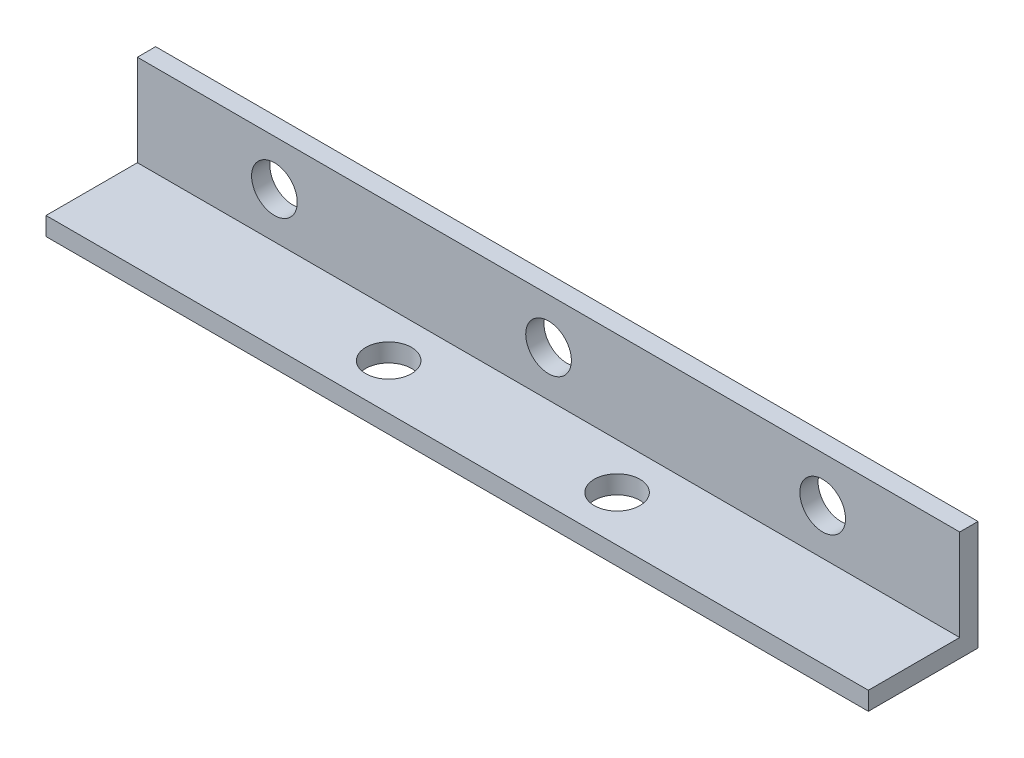
ISO-10303-21;
HEADER;
FILE_DESCRIPTION(('STEP AP214'),'2;1');
FILE_NAME('part.step','',(''),(''),'','','');
FILE_SCHEMA(('AUTOMOTIVE_DESIGN { 1 0 10303 214 1 1 1 1 }'));
ENDSEC;
DATA;
#1=APPLICATION_CONTEXT('core data for automotive mechanical design processes');
#2=APPLICATION_PROTOCOL_DEFINITION('international standard','automotive_design',2000,#1);
#3=PRODUCT_CONTEXT('',#1,'mechanical');
#4=PRODUCT('Part','Part','',(#3));
#5=PRODUCT_RELATED_PRODUCT_CATEGORY('part','',(#4));
#6=PRODUCT_DEFINITION_FORMATION('','',#4);
#7=PRODUCT_DEFINITION_CONTEXT('part definition',#1,'design');
#8=PRODUCT_DEFINITION('design','',#6,#7);
#9=PRODUCT_DEFINITION_SHAPE('','',#8);
#10=(LENGTH_UNIT() NAMED_UNIT(*) SI_UNIT(.MILLI.,.METRE.));
#11=(NAMED_UNIT(*) PLANE_ANGLE_UNIT() SI_UNIT($,.RADIAN.));
#12=(NAMED_UNIT(*) SI_UNIT($,.STERADIAN.) SOLID_ANGLE_UNIT());
#13=UNCERTAINTY_MEASURE_WITH_UNIT(LENGTH_MEASURE(1.E-05),#10,'distance_accuracy_value','');
#14=(GEOMETRIC_REPRESENTATION_CONTEXT(3) GLOBAL_UNCERTAINTY_ASSIGNED_CONTEXT((#13)) GLOBAL_UNIT_ASSIGNED_CONTEXT((#10,
#11,#12)) REPRESENTATION_CONTEXT('',''));
#15=CARTESIAN_POINT('',(0.,0.,0.));
#16=DIRECTION('',(0.,0.,1.));
#17=DIRECTION('',(1.,0.,0.));
#18=AXIS2_PLACEMENT_3D('',#15,#16,#17);
#19=CARTESIAN_POINT('',(0.,2.,0.));
#20=DIRECTION('',(0.,-1.,0.));
#21=DIRECTION('',(0.,0.,-1.));
#22=AXIS2_PLACEMENT_3D('',#19,#20,#21);
#23=PLANE('',#22);
#24=CARTESIAN_POINT('',(-28.6666666666666,2.,-0.416666666666659));
#25=DIRECTION('',(0.,-1.,0.));
#26=DIRECTION('',(0.,0.,-1.));
#27=AXIS2_PLACEMENT_3D('',#24,#25,#26);
#28=CIRCLE('',#27,2.5);
#29=CARTESIAN_POINT('',(-28.6666666666666,2.,-2.91666666666666));
#30=VERTEX_POINT('',#29);
#31=EDGE_CURVE('E139',#30,#30,#28,.T.);
#32=ORIENTED_EDGE('',*,*,#31,.T.);
#33=EDGE_LOOP('',(#32));
#34=FACE_BOUND('',#33,.T.);
#35=CARTESIAN_POINT('',(-3.66666666666664,2.,-0.416666666666659));
#36=DIRECTION('',(0.,-1.,0.));
#37=DIRECTION('',(0.,0.,-1.));
#38=AXIS2_PLACEMENT_3D('',#35,#36,#37);
#39=CIRCLE('',#38,2.5);
#40=CARTESIAN_POINT('',(-3.66666666666664,2.,-2.91666666666666));
#41=VERTEX_POINT('',#40);
#42=EDGE_CURVE('E134',#41,#41,#39,.T.);
#43=ORIENTED_EDGE('',*,*,#42,.T.);
#44=EDGE_LOOP('',(#43));
#45=FACE_BOUND('',#44,.T.);
#46=DIRECTION('',(1.,0.,0.));
#47=VECTOR('',#46,1.);
#48=CARTESIAN_POINT('',(-61.1666666666666,2.,-5.41666666666666));
#49=LINE('',#48,#47);
#50=CARTESIAN_POINT('',(-61.1666666666666,2.,-5.41666666666666));
#51=VERTEX_POINT('',#50);
#52=CARTESIAN_POINT('',(28.8333333333334,2.,-5.41666666666666));
#53=VERTEX_POINT('',#52);
#54=EDGE_CURVE('E53',#51,#53,#49,.T.);
#55=ORIENTED_EDGE('',*,*,#54,.F.);
#56=DIRECTION('',(0.,0.,1.));
#57=VECTOR('',#56,1.);
#58=CARTESIAN_POINT('',(-61.1666666666666,2.,4.58333333333334));
#59=LINE('',#58,#57);
#60=CARTESIAN_POINT('',(-61.1666666666666,2.,4.58333333333334));
#61=VERTEX_POINT('',#60);
#62=EDGE_CURVE('E156',#51,#61,#59,.T.);
#63=ORIENTED_EDGE('',*,*,#62,.T.);
#64=DIRECTION('',(1.,0.,0.));
#65=VECTOR('',#64,1.);
#66=CARTESIAN_POINT('',(-61.1666666666666,2.,4.58333333333334));
#67=LINE('',#66,#65);
#68=CARTESIAN_POINT('',(28.8333333333334,2.,4.58333333333334));
#69=VERTEX_POINT('',#68);
#70=EDGE_CURVE('E59',#61,#69,#67,.T.);
#71=ORIENTED_EDGE('',*,*,#70,.T.);
#72=DIRECTION('',(0.,0.,-1.));
#73=VECTOR('',#72,1.);
#74=CARTESIAN_POINT('',(28.8333333333334,2.,4.58333333333334));
#75=LINE('',#74,#73);
#76=EDGE_CURVE('E88',#69,#53,#75,.T.);
#77=ORIENTED_EDGE('',*,*,#76,.T.);
#78=EDGE_LOOP('',(#55,#63,#71,#77));
#79=FACE_BOUND('',#78,.T.);
#80=ADVANCED_FACE('F36',(#34,#45,#79),#23,.F.);
#81=CARTESIAN_POINT('',(28.8333333333334,2.,4.58333333333334));
#82=DIRECTION('',(-1.,0.,0.));
#83=DIRECTION('',(0.,0.,1.));
#84=AXIS2_PLACEMENT_3D('',#81,#82,#83);
#85=PLANE('',#84);
#86=DIRECTION('',(0.,0.,-1.));
#87=VECTOR('',#86,1.);
#88=CARTESIAN_POINT('',(28.8333333333334,0.,4.58333333333334));
#89=LINE('',#88,#87);
#90=CARTESIAN_POINT('',(28.8333333333334,0.,4.58333333333334));
#91=VERTEX_POINT('',#90);
#92=CARTESIAN_POINT('',(28.8333333333334,0.,-7.41666666666666));
#93=VERTEX_POINT('',#92);
#94=EDGE_CURVE('E94',#91,#93,#89,.T.);
#95=ORIENTED_EDGE('',*,*,#94,.T.);
#96=DIRECTION('',(0.,-1.,0.));
#97=VECTOR('',#96,1.);
#98=CARTESIAN_POINT('',(28.8333333333334,2.,-7.41666666666666));
#99=LINE('',#98,#97);
#100=CARTESIAN_POINT('',(28.8333333333334,12.,-7.41666666666666));
#101=VERTEX_POINT('',#100);
#102=EDGE_CURVE('E11',#101,#93,#99,.T.);
#103=ORIENTED_EDGE('',*,*,#102,.F.);
#104=DIRECTION('',(0.,0.,-1.));
#105=VECTOR('',#104,1.);
#106=CARTESIAN_POINT('',(28.8333333333334,12.,-7.41666666666666));
#107=LINE('',#106,#105);
#108=CARTESIAN_POINT('',(28.8333333333334,12.,-5.41666666666666));
#109=VERTEX_POINT('',#108);
#110=EDGE_CURVE('E148',#109,#101,#107,.T.);
#111=ORIENTED_EDGE('',*,*,#110,.F.);
#112=DIRECTION('',(0.,-1.,0.));
#113=VECTOR('',#112,1.);
#114=CARTESIAN_POINT('',(28.8333333333334,12.,-5.41666666666666));
#115=LINE('',#114,#113);
#116=EDGE_CURVE('E103',#109,#53,#115,.T.);
#117=ORIENTED_EDGE('',*,*,#116,.T.);
#118=ORIENTED_EDGE('',*,*,#76,.F.);
#119=DIRECTION('',(0.,-1.,0.));
#120=VECTOR('',#119,1.);
#121=CARTESIAN_POINT('',(28.8333333333334,2.,4.58333333333334));
#122=LINE('',#121,#120);
#123=EDGE_CURVE('E81',#69,#91,#122,.T.);
#124=ORIENTED_EDGE('',*,*,#123,.T.);
#125=EDGE_LOOP('',(#95,#103,#111,#117,#118,#124));
#126=FACE_BOUND('',#125,.T.);
#127=ADVANCED_FACE('F38',(#126),#85,.F.);
#128=CARTESIAN_POINT('',(-61.1666666666666,2.,-7.41666666666666));
#129=DIRECTION('',(0.,0.,1.));
#130=DIRECTION('',(1.,0.,0.));
#131=AXIS2_PLACEMENT_3D('',#128,#129,#130);
#132=PLANE('',#131);
#133=CARTESIAN_POINT('',(13.8333333333334,7.,-7.41666666666666));
#134=DIRECTION('',(0.,0.,1.));
#135=DIRECTION('',(1.,0.,0.));
#136=AXIS2_PLACEMENT_3D('',#133,#134,#135);
#137=CIRCLE('',#136,2.5);
#138=CARTESIAN_POINT('',(11.3333333333334,7.,-7.41666666666666));
#139=VERTEX_POINT('',#138);
#140=EDGE_CURVE('E127',#139,#139,#137,.T.);
#141=ORIENTED_EDGE('',*,*,#140,.T.);
#142=EDGE_LOOP('',(#141));
#143=FACE_BOUND('',#142,.T.);
#144=CARTESIAN_POINT('',(-16.1666666666666,7.,-7.41666666666666));
#145=DIRECTION('',(0.,0.,1.));
#146=DIRECTION('',(1.,0.,0.));
#147=AXIS2_PLACEMENT_3D('',#144,#145,#146);
#148=CIRCLE('',#147,2.5);
#149=CARTESIAN_POINT('',(-18.6666666666666,7.,-7.41666666666666));
#150=VERTEX_POINT('',#149);
#151=EDGE_CURVE('E117',#150,#150,#148,.T.);
#152=ORIENTED_EDGE('',*,*,#151,.T.);
#153=EDGE_LOOP('',(#152));
#154=FACE_BOUND('',#153,.T.);
#155=CARTESIAN_POINT('',(-46.1666666666666,7.,-7.41666666666666));
#156=DIRECTION('',(0.,0.,1.));
#157=DIRECTION('',(1.,0.,0.));
#158=AXIS2_PLACEMENT_3D('',#155,#156,#157);
#159=CIRCLE('',#158,2.5);
#160=CARTESIAN_POINT('',(-48.6666666666666,7.,-7.41666666666666));
#161=VERTEX_POINT('',#160);
#162=EDGE_CURVE('E114',#161,#161,#159,.T.);
#163=ORIENTED_EDGE('',*,*,#162,.T.);
#164=EDGE_LOOP('',(#163));
#165=FACE_BOUND('',#164,.T.);
#166=DIRECTION('',(-1.,0.,0.));
#167=VECTOR('',#166,1.);
#168=CARTESIAN_POINT('',(-61.1666666666666,0.,-7.41666666666666));
#169=LINE('',#168,#167);
#170=CARTESIAN_POINT('',(-61.1666666666666,0.,-7.41666666666666));
#171=VERTEX_POINT('',#170);
#172=EDGE_CURVE('E98',#93,#171,#169,.T.);
#173=ORIENTED_EDGE('',*,*,#172,.T.);
#174=DIRECTION('',(0.,-1.,0.));
#175=VECTOR('',#174,1.);
#176=CARTESIAN_POINT('',(-61.1666666666666,2.,-7.41666666666666));
#177=LINE('',#176,#175);
#178=CARTESIAN_POINT('',(-61.1666666666666,12.,-7.41666666666666));
#179=VERTEX_POINT('',#178);
#180=EDGE_CURVE('E45',#179,#171,#177,.T.);
#181=ORIENTED_EDGE('',*,*,#180,.F.);
#182=DIRECTION('',(-1.,0.,0.));
#183=VECTOR('',#182,1.);
#184=CARTESIAN_POINT('',(-61.1666666666666,12.,-7.41666666666666));
#185=LINE('',#184,#183);
#186=EDGE_CURVE('E151',#101,#179,#185,.T.);
#187=ORIENTED_EDGE('',*,*,#186,.F.);
#188=ORIENTED_EDGE('',*,*,#102,.T.);
#189=EDGE_LOOP('',(#173,#181,#187,#188));
#190=FACE_BOUND('',#189,.T.);
#191=ADVANCED_FACE('F164',(#143,#154,#165,#190),#132,.F.);
#192=CARTESIAN_POINT('',(-61.1666666666666,2.,4.58333333333334));
#193=DIRECTION('',(1.,0.,0.));
#194=DIRECTION('',(0.,0.,-1.));
#195=AXIS2_PLACEMENT_3D('',#192,#193,#194);
#196=PLANE('',#195);
#197=DIRECTION('',(0.,0.,1.));
#198=VECTOR('',#197,1.);
#199=CARTESIAN_POINT('',(-61.1666666666666,0.,4.58333333333334));
#200=LINE('',#199,#198);
#201=CARTESIAN_POINT('',(-61.1666666666666,0.,4.58333333333334));
#202=VERTEX_POINT('',#201);
#203=EDGE_CURVE('E89',#171,#202,#200,.T.);
#204=ORIENTED_EDGE('',*,*,#203,.T.);
#205=DIRECTION('',(0.,-1.,0.));
#206=VECTOR('',#205,1.);
#207=CARTESIAN_POINT('',(-61.1666666666666,2.,4.58333333333334));
#208=LINE('',#207,#206);
#209=EDGE_CURVE('E84',#61,#202,#208,.T.);
#210=ORIENTED_EDGE('',*,*,#209,.F.);
#211=ORIENTED_EDGE('',*,*,#62,.F.);
#212=DIRECTION('',(0.,-1.,0.));
#213=VECTOR('',#212,1.);
#214=CARTESIAN_POINT('',(-61.1666666666666,12.,-5.41666666666666));
#215=LINE('',#214,#213);
#216=CARTESIAN_POINT('',(-61.1666666666666,12.,-5.41666666666666));
#217=VERTEX_POINT('',#216);
#218=EDGE_CURVE('E99',#217,#51,#215,.T.);
#219=ORIENTED_EDGE('',*,*,#218,.F.);
#220=DIRECTION('',(0.,0.,1.));
#221=VECTOR('',#220,1.);
#222=CARTESIAN_POINT('',(-61.1666666666666,12.,-7.41666666666666));
#223=LINE('',#222,#221);
#224=EDGE_CURVE('E142',#179,#217,#223,.T.);
#225=ORIENTED_EDGE('',*,*,#224,.F.);
#226=ORIENTED_EDGE('',*,*,#180,.T.);
#227=EDGE_LOOP('',(#204,#210,#211,#219,#225,#226));
#228=FACE_BOUND('',#227,.T.);
#229=ADVANCED_FACE('F159',(#228),#196,.F.);
#230=CARTESIAN_POINT('',(-61.1666666666666,2.,4.58333333333334));
#231=DIRECTION('',(0.,0.,-1.));
#232=DIRECTION('',(-1.,0.,0.));
#233=AXIS2_PLACEMENT_3D('',#230,#231,#232);
#234=PLANE('',#233);
#235=DIRECTION('',(1.,0.,0.));
#236=VECTOR('',#235,1.);
#237=CARTESIAN_POINT('',(-61.1666666666666,0.,4.58333333333334));
#238=LINE('',#237,#236);
#239=EDGE_CURVE('E78',#202,#91,#238,.T.);
#240=ORIENTED_EDGE('',*,*,#239,.T.);
#241=ORIENTED_EDGE('',*,*,#123,.F.);
#242=ORIENTED_EDGE('',*,*,#70,.F.);
#243=ORIENTED_EDGE('',*,*,#209,.T.);
#244=EDGE_LOOP('',(#240,#241,#242,#243));
#245=FACE_BOUND('',#244,.T.);
#246=ADVANCED_FACE('F80',(#245),#234,.F.);
#247=CARTESIAN_POINT('',(0.,0.,0.));
#248=DIRECTION('',(0.,-1.,0.));
#249=DIRECTION('',(0.,0.,-1.));
#250=AXIS2_PLACEMENT_3D('',#247,#248,#249);
#251=PLANE('',#250);
#252=CARTESIAN_POINT('',(-28.6666666666666,0.,-0.416666666666659));
#253=DIRECTION('',(0.,1.,0.));
#254=DIRECTION('',(0.,0.,1.));
#255=AXIS2_PLACEMENT_3D('',#252,#253,#254);
#256=CIRCLE('',#255,2.5);
#257=CARTESIAN_POINT('',(-28.6666666666666,0.,2.08333333333334));
#258=VERTEX_POINT('',#257);
#259=EDGE_CURVE('E131',#258,#258,#256,.T.);
#260=ORIENTED_EDGE('',*,*,#259,.T.);
#261=EDGE_LOOP('',(#260));
#262=FACE_BOUND('',#261,.T.);
#263=CARTESIAN_POINT('',(-3.66666666666664,0.,-0.416666666666659));
#264=DIRECTION('',(0.,1.,0.));
#265=DIRECTION('',(0.,0.,1.));
#266=AXIS2_PLACEMENT_3D('',#263,#264,#265);
#267=CIRCLE('',#266,2.5);
#268=CARTESIAN_POINT('',(-3.66666666666664,0.,2.08333333333334));
#269=VERTEX_POINT('',#268);
#270=EDGE_CURVE('E130',#269,#269,#267,.T.);
#271=ORIENTED_EDGE('',*,*,#270,.T.);
#272=EDGE_LOOP('',(#271));
#273=FACE_BOUND('',#272,.T.);
#274=ORIENTED_EDGE('',*,*,#94,.F.);
#275=ORIENTED_EDGE('',*,*,#239,.F.);
#276=ORIENTED_EDGE('',*,*,#203,.F.);
#277=ORIENTED_EDGE('',*,*,#172,.F.);
#278=EDGE_LOOP('',(#274,#275,#276,#277));
#279=FACE_BOUND('',#278,.T.);
#280=ADVANCED_FACE('F97',(#262,#273,#279),#251,.T.);
#281=CARTESIAN_POINT('',(-61.1666666666666,12.,-5.41666666666666));
#282=DIRECTION('',(0.,0.,-1.));
#283=DIRECTION('',(-1.,0.,0.));
#284=AXIS2_PLACEMENT_3D('',#281,#282,#283);
#285=PLANE('',#284);
#286=CARTESIAN_POINT('',(13.8333333333334,7.,-5.41666666666666));
#287=DIRECTION('',(0.,0.,-1.));
#288=DIRECTION('',(-1.,0.,0.));
#289=AXIS2_PLACEMENT_3D('',#286,#287,#288);
#290=CIRCLE('',#289,2.5);
#291=CARTESIAN_POINT('',(11.3333333333334,7.,-5.41666666666666));
#292=VERTEX_POINT('',#291);
#293=EDGE_CURVE('E40',#292,#292,#290,.T.);
#294=ORIENTED_EDGE('',*,*,#293,.T.);
#295=EDGE_LOOP('',(#294));
#296=FACE_BOUND('',#295,.T.);
#297=CARTESIAN_POINT('',(-16.1666666666666,7.,-5.41666666666666));
#298=DIRECTION('',(0.,0.,-1.));
#299=DIRECTION('',(-1.,0.,0.));
#300=AXIS2_PLACEMENT_3D('',#297,#298,#299);
#301=CIRCLE('',#300,2.5);
#302=CARTESIAN_POINT('',(-18.6666666666666,7.,-5.41666666666666));
#303=VERTEX_POINT('',#302);
#304=EDGE_CURVE('E115',#303,#303,#301,.T.);
#305=ORIENTED_EDGE('',*,*,#304,.T.);
#306=EDGE_LOOP('',(#305));
#307=FACE_BOUND('',#306,.T.);
#308=CARTESIAN_POINT('',(-46.1666666666666,7.,-5.41666666666666));
#309=DIRECTION('',(0.,0.,-1.));
#310=DIRECTION('',(-1.,0.,0.));
#311=AXIS2_PLACEMENT_3D('',#308,#309,#310);
#312=CIRCLE('',#311,2.5);
#313=CARTESIAN_POINT('',(-48.6666666666666,7.,-5.41666666666666));
#314=VERTEX_POINT('',#313);
#315=EDGE_CURVE('E112',#314,#314,#312,.T.);
#316=ORIENTED_EDGE('',*,*,#315,.T.);
#317=EDGE_LOOP('',(#316));
#318=FACE_BOUND('',#317,.T.);
#319=ORIENTED_EDGE('',*,*,#54,.T.);
#320=ORIENTED_EDGE('',*,*,#116,.F.);
#321=DIRECTION('',(1.,0.,0.));
#322=VECTOR('',#321,1.);
#323=CARTESIAN_POINT('',(-61.1666666666666,12.,-5.41666666666666));
#324=LINE('',#323,#322);
#325=EDGE_CURVE('E145',#217,#109,#324,.T.);
#326=ORIENTED_EDGE('',*,*,#325,.F.);
#327=ORIENTED_EDGE('',*,*,#218,.T.);
#328=EDGE_LOOP('',(#319,#320,#326,#327));
#329=FACE_BOUND('',#328,.T.);
#330=ADVANCED_FACE('F179',(#296,#307,#318,#329),#285,.F.);
#331=CARTESIAN_POINT('',(0.,12.,0.));
#332=DIRECTION('',(0.,1.,0.));
#333=DIRECTION('',(0.,0.,1.));
#334=AXIS2_PLACEMENT_3D('',#331,#332,#333);
#335=PLANE('',#334);
#336=ORIENTED_EDGE('',*,*,#224,.T.);
#337=ORIENTED_EDGE('',*,*,#325,.T.);
#338=ORIENTED_EDGE('',*,*,#110,.T.);
#339=ORIENTED_EDGE('',*,*,#186,.T.);
#340=EDGE_LOOP('',(#336,#337,#338,#339));
#341=FACE_BOUND('',#340,.T.);
#342=ADVANCED_FACE('F168',(#341),#335,.T.);
#343=CARTESIAN_POINT('',(-3.66666666666664,0.,-0.416666666666659));
#344=DIRECTION('',(0.,1.,0.));
#345=DIRECTION('',(0.,0.,1.));
#346=AXIS2_PLACEMENT_3D('',#343,#344,#345);
#347=CYLINDRICAL_SURFACE('',#346,2.5);
#348=ORIENTED_EDGE('',*,*,#270,.F.);
#349=EDGE_LOOP('',(#348));
#350=FACE_BOUND('',#349,.T.);
#351=ORIENTED_EDGE('',*,*,#42,.F.);
#352=EDGE_LOOP('',(#351));
#353=FACE_BOUND('',#352,.T.);
#354=ADVANCED_FACE('F187',(#350,#353),#347,.F.);
#355=CARTESIAN_POINT('',(-28.6666666666666,0.,-0.416666666666659));
#356=DIRECTION('',(0.,1.,0.));
#357=DIRECTION('',(0.,0.,1.));
#358=AXIS2_PLACEMENT_3D('',#355,#356,#357);
#359=CYLINDRICAL_SURFACE('',#358,2.5);
#360=ORIENTED_EDGE('',*,*,#259,.F.);
#361=EDGE_LOOP('',(#360));
#362=FACE_BOUND('',#361,.T.);
#363=ORIENTED_EDGE('',*,*,#31,.F.);
#364=EDGE_LOOP('',(#363));
#365=FACE_BOUND('',#364,.T.);
#366=ADVANCED_FACE('F223',(#362,#365),#359,.F.);
#367=CARTESIAN_POINT('',(-46.1666666666666,7.,4.58333333333334));
#368=DIRECTION('',(0.,0.,-1.));
#369=DIRECTION('',(-1.,0.,0.));
#370=AXIS2_PLACEMENT_3D('',#367,#368,#369);
#371=CYLINDRICAL_SURFACE('',#370,2.5);
#372=CARTESIAN_POINT('',(-48.6666666666666,7.,-5.41666666666666));
#373=CARTESIAN_POINT('',(-48.6666666666666,7.,-5.43749999999999));
#374=CARTESIAN_POINT('',(-48.6666666666666,7.,-5.45833333333333));
#375=CARTESIAN_POINT('',(-48.6666666666666,7.,-5.49999999999999));
#376=CARTESIAN_POINT('',(-48.6666666666666,7.,-5.52083333333333));
#377=CARTESIAN_POINT('',(-48.6666666666666,7.,-5.56249999999999));
#378=CARTESIAN_POINT('',(-48.6666666666666,7.,-5.58333333333333));
#379=CARTESIAN_POINT('',(-48.6666666666666,7.,-5.62499999999999));
#380=CARTESIAN_POINT('',(-48.6666666666666,7.,-5.64583333333333));
#381=CARTESIAN_POINT('',(-48.6666666666666,7.,-5.68749999999999));
#382=CARTESIAN_POINT('',(-48.6666666666666,7.,-5.70833333333333));
#383=CARTESIAN_POINT('',(-48.6666666666666,7.,-5.74999999999999));
#384=CARTESIAN_POINT('',(-48.6666666666666,7.,-5.77083333333333));
#385=CARTESIAN_POINT('',(-48.6666666666666,7.,-5.81249999999999));
#386=CARTESIAN_POINT('',(-48.6666666666666,7.,-5.83333333333333));
#387=CARTESIAN_POINT('',(-48.6666666666666,7.,-5.87499999999999));
#388=CARTESIAN_POINT('',(-48.6666666666666,7.,-5.89583333333333));
#389=CARTESIAN_POINT('',(-48.6666666666666,7.,-5.93749999999999));
#390=CARTESIAN_POINT('',(-48.6666666666666,7.,-5.95833333333333));
#391=CARTESIAN_POINT('',(-48.6666666666666,7.,-5.99999999999999));
#392=CARTESIAN_POINT('',(-48.6666666666666,7.,-6.02083333333333));
#393=CARTESIAN_POINT('',(-48.6666666666666,7.,-6.06249999999999));
#394=CARTESIAN_POINT('',(-48.6666666666666,7.,-6.08333333333333));
#395=CARTESIAN_POINT('',(-48.6666666666666,7.,-6.12499999999999));
#396=CARTESIAN_POINT('',(-48.6666666666666,7.,-6.14583333333333));
#397=CARTESIAN_POINT('',(-48.6666666666666,7.,-6.18749999999999));
#398=CARTESIAN_POINT('',(-48.6666666666666,7.,-6.20833333333333));
#399=CARTESIAN_POINT('',(-48.6666666666666,7.,-6.24999999999999));
#400=CARTESIAN_POINT('',(-48.6666666666666,7.,-6.27083333333333));
#401=CARTESIAN_POINT('',(-48.6666666666666,7.,-6.31249999999999));
#402=CARTESIAN_POINT('',(-48.6666666666666,7.,-6.33333333333333));
#403=CARTESIAN_POINT('',(-48.6666666666666,7.,-6.37499999999999));
#404=CARTESIAN_POINT('',(-48.6666666666666,7.,-6.39583333333333));
#405=CARTESIAN_POINT('',(-48.6666666666666,7.,-6.43749999999999));
#406=CARTESIAN_POINT('',(-48.6666666666666,7.,-6.45833333333333));
#407=CARTESIAN_POINT('',(-48.6666666666666,7.,-6.49999999999999));
#408=CARTESIAN_POINT('',(-48.6666666666666,7.,-6.52083333333333));
#409=CARTESIAN_POINT('',(-48.6666666666666,7.,-6.56249999999999));
#410=CARTESIAN_POINT('',(-48.6666666666666,7.,-6.58333333333333));
#411=CARTESIAN_POINT('',(-48.6666666666666,7.,-6.62499999999999));
#412=CARTESIAN_POINT('',(-48.6666666666666,7.,-6.64583333333333));
#413=CARTESIAN_POINT('',(-48.6666666666666,7.,-6.68749999999999));
#414=CARTESIAN_POINT('',(-48.6666666666666,7.,-6.70833333333333));
#415=CARTESIAN_POINT('',(-48.6666666666666,7.,-6.74999999999999));
#416=CARTESIAN_POINT('',(-48.6666666666666,7.,-6.77083333333333));
#417=CARTESIAN_POINT('',(-48.6666666666666,7.,-6.81249999999999));
#418=CARTESIAN_POINT('',(-48.6666666666666,7.,-6.83333333333333));
#419=CARTESIAN_POINT('',(-48.6666666666666,7.,-6.87499999999999));
#420=CARTESIAN_POINT('',(-48.6666666666666,7.,-6.89583333333333));
#421=CARTESIAN_POINT('',(-48.6666666666666,7.,-6.93749999999999));
#422=CARTESIAN_POINT('',(-48.6666666666666,7.,-6.95833333333333));
#423=CARTESIAN_POINT('',(-48.6666666666666,7.,-6.99999999999999));
#424=CARTESIAN_POINT('',(-48.6666666666666,7.,-7.02083333333333));
#425=CARTESIAN_POINT('',(-48.6666666666666,7.,-7.06249999999999));
#426=CARTESIAN_POINT('',(-48.6666666666666,7.,-7.08333333333333));
#427=CARTESIAN_POINT('',(-48.6666666666666,7.,-7.12499999999999));
#428=CARTESIAN_POINT('',(-48.6666666666666,7.,-7.14583333333333));
#429=CARTESIAN_POINT('',(-48.6666666666666,7.,-7.18749999999999));
#430=CARTESIAN_POINT('',(-48.6666666666666,7.,-7.20833333333333));
#431=CARTESIAN_POINT('',(-48.6666666666666,7.,-7.24999999999999));
#432=CARTESIAN_POINT('',(-48.6666666666666,7.,-7.27083333333333));
#433=CARTESIAN_POINT('',(-48.6666666666666,7.,-7.31249999999999));
#434=CARTESIAN_POINT('',(-48.6666666666666,7.,-7.33333333333333));
#435=CARTESIAN_POINT('',(-48.6666666666666,7.,-7.37499999999999));
#436=CARTESIAN_POINT('',(-48.6666666666666,7.,-7.39583333333333));
#437=CARTESIAN_POINT('',(-48.6666666666666,7.,-7.41666666666666));
#438=B_SPLINE_CURVE_WITH_KNOTS('',3,(#372,#373,#374,#375,#376,#377,#378,#379,#380,#381,#382,
#383,#384,#385,#386,#387,#388,#389,#390,#391,#392,#393,#394,#395,#396,#397,#398,#399,#400,#401,
#402,#403,#404,#405,#406,#407,#408,#409,#410,#411,#412,#413,#414,#415,#416,#417,#418,#419,#420,
#421,#422,#423,#424,#425,#426,#427,#428,#429,#430,#431,#432,#433,#434,#435,#436,#437),
.UNSPECIFIED.,.F.,.F.,(4,2,2,2,2,2,2,2,2,2,2,2,2,2,2,2,2,2,2,2,2,2,2,2,2,2,2,2,2,2,2,2,4),(0.,
0.0625000000000001,0.125,0.1875,0.25,0.3125,0.375,0.4375,0.5,0.5625,0.625000000000001,
0.687500000000001,0.750000000000001,0.812500000000001,0.875000000000001,0.937500000000001,1.,
1.0625,1.125,1.1875,1.25,1.3125,1.375,1.4375,1.5,1.5625,1.625,1.6875,1.75,1.8125,1.875,1.9375,
2.),.UNSPECIFIED.);
#439=EDGE_CURVE('BSEAM214',#314,#161,#438,.T.);
#440=ORIENTED_EDGE('',*,*,#315,.F.);
#441=ORIENTED_EDGE('',*,*,#162,.F.);
#442=ORIENTED_EDGE('',*,*,#439,.T.);
#443=ORIENTED_EDGE('',*,*,#439,.F.);
#444=EDGE_LOOP('',(#440,#442,#441,#443));
#445=FACE_BOUND('',#444,.T.);
#446=ADVANCED_FACE('F214',(#445),#371,.F.);
#447=CARTESIAN_POINT('',(-16.1666666666666,7.,4.58333333333334));
#448=DIRECTION('',(0.,0.,-1.));
#449=DIRECTION('',(-1.,0.,0.));
#450=AXIS2_PLACEMENT_3D('',#447,#448,#449);
#451=CYLINDRICAL_SURFACE('',#450,2.5);
#452=CARTESIAN_POINT('',(-18.6666666666666,7.,-5.41666666666666));
#453=CARTESIAN_POINT('',(-18.6666666666666,7.,-5.43749999999999));
#454=CARTESIAN_POINT('',(-18.6666666666666,7.,-5.45833333333333));
#455=CARTESIAN_POINT('',(-18.6666666666666,7.,-5.49999999999999));
#456=CARTESIAN_POINT('',(-18.6666666666666,7.,-5.52083333333333));
#457=CARTESIAN_POINT('',(-18.6666666666666,7.,-5.56249999999999));
#458=CARTESIAN_POINT('',(-18.6666666666666,7.,-5.58333333333333));
#459=CARTESIAN_POINT('',(-18.6666666666666,7.,-5.62499999999999));
#460=CARTESIAN_POINT('',(-18.6666666666666,7.,-5.64583333333333));
#461=CARTESIAN_POINT('',(-18.6666666666666,7.,-5.68749999999999));
#462=CARTESIAN_POINT('',(-18.6666666666666,7.,-5.70833333333333));
#463=CARTESIAN_POINT('',(-18.6666666666666,7.,-5.74999999999999));
#464=CARTESIAN_POINT('',(-18.6666666666666,7.,-5.77083333333333));
#465=CARTESIAN_POINT('',(-18.6666666666666,7.,-5.81249999999999));
#466=CARTESIAN_POINT('',(-18.6666666666666,7.,-5.83333333333333));
#467=CARTESIAN_POINT('',(-18.6666666666666,7.,-5.87499999999999));
#468=CARTESIAN_POINT('',(-18.6666666666666,7.,-5.89583333333333));
#469=CARTESIAN_POINT('',(-18.6666666666666,7.,-5.93749999999999));
#470=CARTESIAN_POINT('',(-18.6666666666666,7.,-5.95833333333333));
#471=CARTESIAN_POINT('',(-18.6666666666666,7.,-5.99999999999999));
#472=CARTESIAN_POINT('',(-18.6666666666666,7.,-6.02083333333333));
#473=CARTESIAN_POINT('',(-18.6666666666666,7.,-6.06249999999999));
#474=CARTESIAN_POINT('',(-18.6666666666666,7.,-6.08333333333333));
#475=CARTESIAN_POINT('',(-18.6666666666666,7.,-6.12499999999999));
#476=CARTESIAN_POINT('',(-18.6666666666666,7.,-6.14583333333333));
#477=CARTESIAN_POINT('',(-18.6666666666666,7.,-6.18749999999999));
#478=CARTESIAN_POINT('',(-18.6666666666666,7.,-6.20833333333333));
#479=CARTESIAN_POINT('',(-18.6666666666666,7.,-6.24999999999999));
#480=CARTESIAN_POINT('',(-18.6666666666666,7.,-6.27083333333333));
#481=CARTESIAN_POINT('',(-18.6666666666666,7.,-6.31249999999999));
#482=CARTESIAN_POINT('',(-18.6666666666666,7.,-6.33333333333333));
#483=CARTESIAN_POINT('',(-18.6666666666666,7.,-6.37499999999999));
#484=CARTESIAN_POINT('',(-18.6666666666666,7.,-6.39583333333333));
#485=CARTESIAN_POINT('',(-18.6666666666666,7.,-6.43749999999999));
#486=CARTESIAN_POINT('',(-18.6666666666666,7.,-6.45833333333333));
#487=CARTESIAN_POINT('',(-18.6666666666666,7.,-6.49999999999999));
#488=CARTESIAN_POINT('',(-18.6666666666666,7.,-6.52083333333333));
#489=CARTESIAN_POINT('',(-18.6666666666666,7.,-6.56249999999999));
#490=CARTESIAN_POINT('',(-18.6666666666666,7.,-6.58333333333333));
#491=CARTESIAN_POINT('',(-18.6666666666666,7.,-6.62499999999999));
#492=CARTESIAN_POINT('',(-18.6666666666666,7.,-6.64583333333333));
#493=CARTESIAN_POINT('',(-18.6666666666666,7.,-6.68749999999999));
#494=CARTESIAN_POINT('',(-18.6666666666666,7.,-6.70833333333333));
#495=CARTESIAN_POINT('',(-18.6666666666666,7.,-6.74999999999999));
#496=CARTESIAN_POINT('',(-18.6666666666666,7.,-6.77083333333333));
#497=CARTESIAN_POINT('',(-18.6666666666666,7.,-6.81249999999999));
#498=CARTESIAN_POINT('',(-18.6666666666666,7.,-6.83333333333333));
#499=CARTESIAN_POINT('',(-18.6666666666666,7.,-6.87499999999999));
#500=CARTESIAN_POINT('',(-18.6666666666666,7.,-6.89583333333333));
#501=CARTESIAN_POINT('',(-18.6666666666666,7.,-6.93749999999999));
#502=CARTESIAN_POINT('',(-18.6666666666666,7.,-6.95833333333333));
#503=CARTESIAN_POINT('',(-18.6666666666666,7.,-6.99999999999999));
#504=CARTESIAN_POINT('',(-18.6666666666666,7.,-7.02083333333333));
#505=CARTESIAN_POINT('',(-18.6666666666666,7.,-7.06249999999999));
#506=CARTESIAN_POINT('',(-18.6666666666666,7.,-7.08333333333333));
#507=CARTESIAN_POINT('',(-18.6666666666666,7.,-7.12499999999999));
#508=CARTESIAN_POINT('',(-18.6666666666666,7.,-7.14583333333333));
#509=CARTESIAN_POINT('',(-18.6666666666666,7.,-7.18749999999999));
#510=CARTESIAN_POINT('',(-18.6666666666666,7.,-7.20833333333333));
#511=CARTESIAN_POINT('',(-18.6666666666666,7.,-7.24999999999999));
#512=CARTESIAN_POINT('',(-18.6666666666666,7.,-7.27083333333333));
#513=CARTESIAN_POINT('',(-18.6666666666666,7.,-7.31249999999999));
#514=CARTESIAN_POINT('',(-18.6666666666666,7.,-7.33333333333333));
#515=CARTESIAN_POINT('',(-18.6666666666666,7.,-7.37499999999999));
#516=CARTESIAN_POINT('',(-18.6666666666666,7.,-7.39583333333333));
#517=CARTESIAN_POINT('',(-18.6666666666666,7.,-7.41666666666666));
#518=B_SPLINE_CURVE_WITH_KNOTS('',3,(#452,#453,#454,#455,#456,#457,#458,#459,#460,#461,#462,
#463,#464,#465,#466,#467,#468,#469,#470,#471,#472,#473,#474,#475,#476,#477,#478,#479,#480,#481,
#482,#483,#484,#485,#486,#487,#488,#489,#490,#491,#492,#493,#494,#495,#496,#497,#498,#499,#500,
#501,#502,#503,#504,#505,#506,#507,#508,#509,#510,#511,#512,#513,#514,#515,#516,#517),
.UNSPECIFIED.,.F.,.F.,(4,2,2,2,2,2,2,2,2,2,2,2,2,2,2,2,2,2,2,2,2,2,2,2,2,2,2,2,2,2,2,2,4),(0.,
0.0625000000000001,0.125,0.1875,0.25,0.3125,0.375,0.4375,0.5,0.5625,0.625000000000001,
0.687500000000001,0.750000000000001,0.812500000000001,0.875000000000001,0.937500000000001,1.,
1.0625,1.125,1.1875,1.25,1.3125,1.375,1.4375,1.5,1.5625,1.625,1.6875,1.75,1.8125,1.875,1.9375,
2.),.UNSPECIFIED.);
#519=EDGE_CURVE('BSEAM211',#303,#150,#518,.T.);
#520=ORIENTED_EDGE('',*,*,#304,.F.);
#521=ORIENTED_EDGE('',*,*,#151,.F.);
#522=ORIENTED_EDGE('',*,*,#519,.T.);
#523=ORIENTED_EDGE('',*,*,#519,.F.);
#524=EDGE_LOOP('',(#520,#522,#521,#523));
#525=FACE_BOUND('',#524,.T.);
#526=ADVANCED_FACE('F211',(#525),#451,.F.);
#527=CARTESIAN_POINT('',(13.8333333333334,7.,4.58333333333334));
#528=DIRECTION('',(0.,0.,-1.));
#529=DIRECTION('',(-1.,0.,0.));
#530=AXIS2_PLACEMENT_3D('',#527,#528,#529);
#531=CYLINDRICAL_SURFACE('',#530,2.5);
#532=CARTESIAN_POINT('',(11.3333333333334,7.,-5.41666666666666));
#533=CARTESIAN_POINT('',(11.3333333333334,7.,-5.43749999999999));
#534=CARTESIAN_POINT('',(11.3333333333334,7.,-5.45833333333333));
#535=CARTESIAN_POINT('',(11.3333333333334,7.,-5.49999999999999));
#536=CARTESIAN_POINT('',(11.3333333333334,7.,-5.52083333333333));
#537=CARTESIAN_POINT('',(11.3333333333334,7.,-5.56249999999999));
#538=CARTESIAN_POINT('',(11.3333333333334,7.,-5.58333333333333));
#539=CARTESIAN_POINT('',(11.3333333333334,7.,-5.62499999999999));
#540=CARTESIAN_POINT('',(11.3333333333334,7.,-5.64583333333333));
#541=CARTESIAN_POINT('',(11.3333333333334,7.,-5.68749999999999));
#542=CARTESIAN_POINT('',(11.3333333333334,7.,-5.70833333333333));
#543=CARTESIAN_POINT('',(11.3333333333334,7.,-5.74999999999999));
#544=CARTESIAN_POINT('',(11.3333333333334,7.,-5.77083333333333));
#545=CARTESIAN_POINT('',(11.3333333333334,7.,-5.81249999999999));
#546=CARTESIAN_POINT('',(11.3333333333334,7.,-5.83333333333333));
#547=CARTESIAN_POINT('',(11.3333333333334,7.,-5.87499999999999));
#548=CARTESIAN_POINT('',(11.3333333333334,7.,-5.89583333333333));
#549=CARTESIAN_POINT('',(11.3333333333334,7.,-5.93749999999999));
#550=CARTESIAN_POINT('',(11.3333333333334,7.,-5.95833333333333));
#551=CARTESIAN_POINT('',(11.3333333333334,7.,-5.99999999999999));
#552=CARTESIAN_POINT('',(11.3333333333334,7.,-6.02083333333333));
#553=CARTESIAN_POINT('',(11.3333333333334,7.,-6.06249999999999));
#554=CARTESIAN_POINT('',(11.3333333333334,7.,-6.08333333333333));
#555=CARTESIAN_POINT('',(11.3333333333334,7.,-6.12499999999999));
#556=CARTESIAN_POINT('',(11.3333333333334,7.,-6.14583333333333));
#557=CARTESIAN_POINT('',(11.3333333333334,7.,-6.18749999999999));
#558=CARTESIAN_POINT('',(11.3333333333334,7.,-6.20833333333333));
#559=CARTESIAN_POINT('',(11.3333333333334,7.,-6.24999999999999));
#560=CARTESIAN_POINT('',(11.3333333333334,7.,-6.27083333333333));
#561=CARTESIAN_POINT('',(11.3333333333334,7.,-6.31249999999999));
#562=CARTESIAN_POINT('',(11.3333333333334,7.,-6.33333333333333));
#563=CARTESIAN_POINT('',(11.3333333333334,7.,-6.37499999999999));
#564=CARTESIAN_POINT('',(11.3333333333334,7.,-6.39583333333333));
#565=CARTESIAN_POINT('',(11.3333333333334,7.,-6.43749999999999));
#566=CARTESIAN_POINT('',(11.3333333333334,7.,-6.45833333333333));
#567=CARTESIAN_POINT('',(11.3333333333334,7.,-6.49999999999999));
#568=CARTESIAN_POINT('',(11.3333333333334,7.,-6.52083333333333));
#569=CARTESIAN_POINT('',(11.3333333333334,7.,-6.56249999999999));
#570=CARTESIAN_POINT('',(11.3333333333334,7.,-6.58333333333333));
#571=CARTESIAN_POINT('',(11.3333333333334,7.,-6.62499999999999));
#572=CARTESIAN_POINT('',(11.3333333333334,7.,-6.64583333333333));
#573=CARTESIAN_POINT('',(11.3333333333334,7.,-6.68749999999999));
#574=CARTESIAN_POINT('',(11.3333333333334,7.,-6.70833333333333));
#575=CARTESIAN_POINT('',(11.3333333333334,7.,-6.74999999999999));
#576=CARTESIAN_POINT('',(11.3333333333334,7.,-6.77083333333333));
#577=CARTESIAN_POINT('',(11.3333333333334,7.,-6.81249999999999));
#578=CARTESIAN_POINT('',(11.3333333333334,7.,-6.83333333333333));
#579=CARTESIAN_POINT('',(11.3333333333334,7.,-6.87499999999999));
#580=CARTESIAN_POINT('',(11.3333333333334,7.,-6.89583333333333));
#581=CARTESIAN_POINT('',(11.3333333333334,7.,-6.93749999999999));
#582=CARTESIAN_POINT('',(11.3333333333334,7.,-6.95833333333333));
#583=CARTESIAN_POINT('',(11.3333333333334,7.,-6.99999999999999));
#584=CARTESIAN_POINT('',(11.3333333333334,7.,-7.02083333333333));
#585=CARTESIAN_POINT('',(11.3333333333334,7.,-7.06249999999999));
#586=CARTESIAN_POINT('',(11.3333333333334,7.,-7.08333333333333));
#587=CARTESIAN_POINT('',(11.3333333333334,7.,-7.12499999999999));
#588=CARTESIAN_POINT('',(11.3333333333334,7.,-7.14583333333333));
#589=CARTESIAN_POINT('',(11.3333333333334,7.,-7.18749999999999));
#590=CARTESIAN_POINT('',(11.3333333333334,7.,-7.20833333333333));
#591=CARTESIAN_POINT('',(11.3333333333334,7.,-7.24999999999999));
#592=CARTESIAN_POINT('',(11.3333333333334,7.,-7.27083333333333));
#593=CARTESIAN_POINT('',(11.3333333333334,7.,-7.31249999999999));
#594=CARTESIAN_POINT('',(11.3333333333334,7.,-7.33333333333333));
#595=CARTESIAN_POINT('',(11.3333333333334,7.,-7.37499999999999));
#596=CARTESIAN_POINT('',(11.3333333333334,7.,-7.39583333333333));
#597=CARTESIAN_POINT('',(11.3333333333334,7.,-7.41666666666666));
#598=B_SPLINE_CURVE_WITH_KNOTS('',3,(#532,#533,#534,#535,#536,#537,#538,#539,#540,#541,#542,
#543,#544,#545,#546,#547,#548,#549,#550,#551,#552,#553,#554,#555,#556,#557,#558,#559,#560,#561,
#562,#563,#564,#565,#566,#567,#568,#569,#570,#571,#572,#573,#574,#575,#576,#577,#578,#579,#580,
#581,#582,#583,#584,#585,#586,#587,#588,#589,#590,#591,#592,#593,#594,#595,#596,#597),
.UNSPECIFIED.,.F.,.F.,(4,2,2,2,2,2,2,2,2,2,2,2,2,2,2,2,2,2,2,2,2,2,2,2,2,2,2,2,2,2,2,2,4),(0.,
0.0625000000000001,0.125,0.1875,0.25,0.3125,0.375,0.4375,0.5,0.5625,0.625000000000001,
0.687500000000001,0.750000000000001,0.812500000000001,0.875000000000001,0.937500000000001,1.,
1.0625,1.125,1.1875,1.25,1.3125,1.375,1.4375,1.5,1.5625,1.625,1.6875,1.75,1.8125,1.875,1.9375,
2.),.UNSPECIFIED.);
#599=EDGE_CURVE('BSEAM213',#292,#139,#598,.T.);
#600=ORIENTED_EDGE('',*,*,#293,.F.);
#601=ORIENTED_EDGE('',*,*,#140,.F.);
#602=ORIENTED_EDGE('',*,*,#599,.T.);
#603=ORIENTED_EDGE('',*,*,#599,.F.);
#604=EDGE_LOOP('',(#600,#602,#601,#603));
#605=FACE_BOUND('',#604,.T.);
#606=ADVANCED_FACE('F213',(#605),#531,.F.);
#607=CLOSED_SHELL('',(#80,#127,#191,#229,#246,#280,#330,#342,#354,#366,#446,#526,#606));
#608=MANIFOLD_SOLID_BREP('B2',#607);
#609=ADVANCED_BREP_SHAPE_REPRESENTATION('',(#18,#608),#14);
#610=SHAPE_DEFINITION_REPRESENTATION(#9,#609);
ENDSEC;
END-ISO-10303-21;
